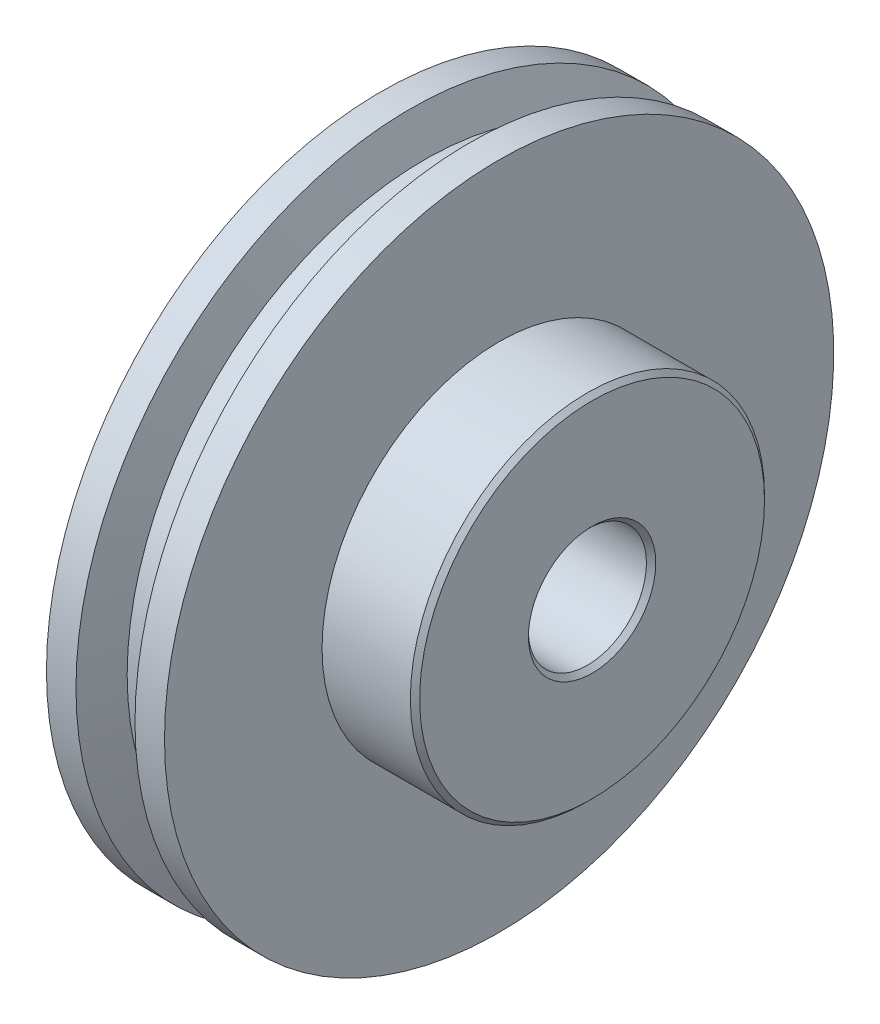
ISO-10303-21;
HEADER;
FILE_DESCRIPTION(('STEP AP214'),'2;1');
FILE_NAME('part.step','',(''),(''),'','','');
FILE_SCHEMA(('AUTOMOTIVE_DESIGN { 1 0 10303 214 1 1 1 1 }'));
ENDSEC;
DATA;
#1=APPLICATION_CONTEXT('core data for automotive mechanical design processes');
#2=APPLICATION_PROTOCOL_DEFINITION('international standard','automotive_design',2000,#1);
#3=PRODUCT_CONTEXT('',#1,'mechanical');
#4=PRODUCT('Part','Part','',(#3));
#5=PRODUCT_RELATED_PRODUCT_CATEGORY('part','',(#4));
#6=PRODUCT_DEFINITION_FORMATION('','',#4);
#7=PRODUCT_DEFINITION_CONTEXT('part definition',#1,'design');
#8=PRODUCT_DEFINITION('design','',#6,#7);
#9=PRODUCT_DEFINITION_SHAPE('','',#8);
#10=(LENGTH_UNIT() NAMED_UNIT(*) SI_UNIT(.MILLI.,.METRE.));
#11=(NAMED_UNIT(*) PLANE_ANGLE_UNIT() SI_UNIT($,.RADIAN.));
#12=(NAMED_UNIT(*) SI_UNIT($,.STERADIAN.) SOLID_ANGLE_UNIT());
#13=UNCERTAINTY_MEASURE_WITH_UNIT(LENGTH_MEASURE(1.E-05),#10,'distance_accuracy_value','');
#14=(GEOMETRIC_REPRESENTATION_CONTEXT(3) GLOBAL_UNCERTAINTY_ASSIGNED_CONTEXT((#13)) GLOBAL_UNIT_ASSIGNED_CONTEXT((#10,
#11,#12)) REPRESENTATION_CONTEXT('',''));
#15=CARTESIAN_POINT('',(0.,0.,0.));
#16=DIRECTION('',(0.,0.,1.));
#17=DIRECTION('',(1.,0.,0.));
#18=AXIS2_PLACEMENT_3D('',#15,#16,#17);
#19=CARTESIAN_POINT('',(3.175,3.175,0.));
#20=DIRECTION('',(-1.,0.,0.));
#21=DIRECTION('',(0.,0.,1.));
#22=AXIS2_PLACEMENT_3D('',#19,#20,#21);
#23=PLANE('',#22);
#24=CARTESIAN_POINT('',(3.175,0.,0.));
#25=DIRECTION('',(-1.,0.,0.));
#26=DIRECTION('',(0.,0.,1.));
#27=AXIS2_PLACEMENT_3D('',#24,#25,#26);
#28=CIRCLE('',#27,18.);
#29=CARTESIAN_POINT('',(3.175,0.,18.));
#30=VERTEX_POINT('',#29);
#31=EDGE_CURVE('E78',#30,#30,#28,.T.);
#32=ORIENTED_EDGE('',*,*,#31,.F.);
#33=EDGE_LOOP('',(#32));
#34=FACE_BOUND('',#33,.T.);
#35=CARTESIAN_POINT('',(3.175,0.,0.));
#36=DIRECTION('',(-1.,0.,0.));
#37=DIRECTION('',(0.,0.,1.));
#38=AXIS2_PLACEMENT_3D('',#35,#36,#37);
#39=CIRCLE('',#38,9.525);
#40=CARTESIAN_POINT('',(3.175,0.,9.525));
#41=VERTEX_POINT('',#40);
#42=EDGE_CURVE('E60',#41,#41,#39,.F.);
#43=ORIENTED_EDGE('',*,*,#42,.F.);
#44=EDGE_LOOP('',(#43));
#45=FACE_BOUND('',#44,.T.);
#46=ADVANCED_FACE('F34',(#34,#45),#23,.F.);
#47=CARTESIAN_POINT('',(-3.175,3.175,0.));
#48=DIRECTION('',(1.,0.,0.));
#49=DIRECTION('',(0.,0.,-1.));
#50=AXIS2_PLACEMENT_3D('',#47,#48,#49);
#51=PLANE('',#50);
#52=CARTESIAN_POINT('',(-3.175,0.,0.));
#53=DIRECTION('',(1.,0.,0.));
#54=DIRECTION('',(0.,0.,-1.));
#55=AXIS2_PLACEMENT_3D('',#52,#53,#54);
#56=CIRCLE('',#55,3.425);
#57=CARTESIAN_POINT('',(-3.175,0.,-3.425));
#58=VERTEX_POINT('',#57);
#59=EDGE_CURVE('E49',#58,#58,#56,.T.);
#60=ORIENTED_EDGE('',*,*,#59,.T.);
#61=EDGE_LOOP('',(#60));
#62=FACE_BOUND('',#61,.T.);
#63=CARTESIAN_POINT('',(-3.175,0.,0.));
#64=DIRECTION('',(-1.,0.,0.));
#65=DIRECTION('',(0.,0.,1.));
#66=AXIS2_PLACEMENT_3D('',#63,#64,#65);
#67=CIRCLE('',#66,18.);
#68=CARTESIAN_POINT('',(-3.175,0.,18.));
#69=VERTEX_POINT('',#68);
#70=EDGE_CURVE('E63',#69,#69,#67,.T.);
#71=ORIENTED_EDGE('',*,*,#70,.T.);
#72=EDGE_LOOP('',(#71));
#73=FACE_BOUND('',#72,.T.);
#74=ADVANCED_FACE('F86',(#62,#73),#51,.F.);
#75=CARTESIAN_POINT('',(0.,0.,0.));
#76=DIRECTION('',(-1.,0.,0.));
#77=DIRECTION('',(0.,0.,1.));
#78=AXIS2_PLACEMENT_3D('',#75,#76,#77);
#79=CYLINDRICAL_SURFACE('',#78,18.);
#80=ORIENTED_EDGE('',*,*,#70,.F.);
#81=EDGE_LOOP('',(#80));
#82=FACE_BOUND('',#81,.T.);
#83=CARTESIAN_POINT('',(-1.5875,0.,0.));
#84=DIRECTION('',(-1.,0.,0.));
#85=DIRECTION('',(0.,0.,1.));
#86=AXIS2_PLACEMENT_3D('',#83,#84,#85);
#87=CIRCLE('',#86,18.);
#88=CARTESIAN_POINT('',(-1.5875,0.,18.));
#89=VERTEX_POINT('',#88);
#90=EDGE_CURVE('E66',#89,#89,#87,.T.);
#91=ORIENTED_EDGE('',*,*,#90,.T.);
#92=EDGE_LOOP('',(#91));
#93=FACE_BOUND('',#92,.T.);
#94=ADVANCED_FACE('F118',(#82,#93),#79,.T.);
#95=CARTESIAN_POINT('',(-0.833641219368297,0.,0.));
#96=DIRECTION('',(-1.,0.,0.));
#97=DIRECTION('',(0.,0.,1.));
#98=AXIS2_PLACEMENT_3D('',#95,#96,#97);
#99=CONICAL_SURFACE('',#98,16.,1.21033521014277);
#100=ORIENTED_EDGE('',*,*,#90,.F.);
#101=EDGE_LOOP('',(#100));
#102=FACE_BOUND('',#101,.T.);
#103=CARTESIAN_POINT('',(-0.833641219368297,0.,0.));
#104=DIRECTION('',(-1.,0.,0.));
#105=DIRECTION('',(0.,0.,1.));
#106=AXIS2_PLACEMENT_3D('',#103,#104,#105);
#107=CIRCLE('',#106,16.);
#108=CARTESIAN_POINT('',(-0.833641219368297,0.,16.));
#109=VERTEX_POINT('',#108);
#110=EDGE_CURVE('E69',#109,#109,#107,.T.);
#111=ORIENTED_EDGE('',*,*,#110,.T.);
#112=EDGE_LOOP('',(#111));
#113=FACE_BOUND('',#112,.T.);
#114=ADVANCED_FACE('F114',(#102,#113),#99,.T.);
#115=CARTESIAN_POINT('',(0.,0.,0.));
#116=DIRECTION('',(-1.,0.,0.));
#117=DIRECTION('',(0.,0.,1.));
#118=AXIS2_PLACEMENT_3D('',#115,#116,#117);
#119=CYLINDRICAL_SURFACE('',#118,16.);
#120=ORIENTED_EDGE('',*,*,#110,.F.);
#121=EDGE_LOOP('',(#120));
#122=FACE_BOUND('',#121,.T.);
#123=CARTESIAN_POINT('',(0.833641219368297,0.,0.));
#124=DIRECTION('',(-1.,0.,0.));
#125=DIRECTION('',(0.,0.,1.));
#126=AXIS2_PLACEMENT_3D('',#123,#124,#125);
#127=CIRCLE('',#126,16.);
#128=CARTESIAN_POINT('',(0.833641219368297,0.,16.));
#129=VERTEX_POINT('',#128);
#130=EDGE_CURVE('E72',#129,#129,#127,.T.);
#131=ORIENTED_EDGE('',*,*,#130,.T.);
#132=EDGE_LOOP('',(#131));
#133=FACE_BOUND('',#132,.T.);
#134=ADVANCED_FACE('F110',(#122,#133),#119,.T.);
#135=CARTESIAN_POINT('',(1.5875,0.,0.));
#136=DIRECTION('',(1.,0.,0.));
#137=DIRECTION('',(0.,0.,-1.));
#138=AXIS2_PLACEMENT_3D('',#135,#136,#137);
#139=CONICAL_SURFACE('',#138,18.,1.21033521014277);
#140=ORIENTED_EDGE('',*,*,#130,.F.);
#141=EDGE_LOOP('',(#140));
#142=FACE_BOUND('',#141,.T.);
#143=CARTESIAN_POINT('',(1.5875,0.,0.));
#144=DIRECTION('',(-1.,0.,0.));
#145=DIRECTION('',(0.,0.,1.));
#146=AXIS2_PLACEMENT_3D('',#143,#144,#145);
#147=CIRCLE('',#146,18.);
#148=CARTESIAN_POINT('',(1.5875,0.,18.));
#149=VERTEX_POINT('',#148);
#150=EDGE_CURVE('E75',#149,#149,#147,.T.);
#151=ORIENTED_EDGE('',*,*,#150,.T.);
#152=EDGE_LOOP('',(#151));
#153=FACE_BOUND('',#152,.T.);
#154=ADVANCED_FACE('F106',(#142,#153),#139,.T.);
#155=CARTESIAN_POINT('',(0.,0.,0.));
#156=DIRECTION('',(-1.,0.,0.));
#157=DIRECTION('',(0.,0.,1.));
#158=AXIS2_PLACEMENT_3D('',#155,#156,#157);
#159=CYLINDRICAL_SURFACE('',#158,18.);
#160=ORIENTED_EDGE('',*,*,#150,.F.);
#161=EDGE_LOOP('',(#160));
#162=FACE_BOUND('',#161,.T.);
#163=ORIENTED_EDGE('',*,*,#31,.T.);
#164=EDGE_LOOP('',(#163));
#165=FACE_BOUND('',#164,.T.);
#166=ADVANCED_FACE('F82',(#162,#165),#159,.T.);
#167=CARTESIAN_POINT('',(0.,0.,0.));
#168=DIRECTION('',(-1.,0.,0.));
#169=DIRECTION('',(0.,0.,1.));
#170=AXIS2_PLACEMENT_3D('',#167,#168,#169);
#171=CYLINDRICAL_SURFACE('',#170,3.175);
#172=CARTESIAN_POINT('',(-2.92500000000001,0.,0.));
#173=DIRECTION('',(1.,0.,0.));
#174=DIRECTION('',(0.,0.,-1.));
#175=AXIS2_PLACEMENT_3D('',#172,#173,#174);
#176=CIRCLE('',#175,3.175);
#177=CARTESIAN_POINT('',(-2.92500000000001,0.,-3.175));
#178=VERTEX_POINT('',#177);
#179=EDGE_CURVE('E54',#178,#178,#176,.F.);
#180=ORIENTED_EDGE('',*,*,#179,.T.);
#181=EDGE_LOOP('',(#180));
#182=FACE_BOUND('',#181,.T.);
#183=CARTESIAN_POINT('',(7.92500000000001,0.,0.));
#184=DIRECTION('',(1.,0.,0.));
#185=DIRECTION('',(0.,0.,-1.));
#186=AXIS2_PLACEMENT_3D('',#183,#184,#185);
#187=CIRCLE('',#186,3.175);
#188=CARTESIAN_POINT('',(7.92500000000001,0.,-3.175));
#189=VERTEX_POINT('',#188);
#190=EDGE_CURVE('E57',#189,#189,#187,.T.);
#191=ORIENTED_EDGE('',*,*,#190,.T.);
#192=EDGE_LOOP('',(#191));
#193=FACE_BOUND('',#192,.T.);
#194=ADVANCED_FACE('F93',(#182,#193),#171,.F.);
#195=CARTESIAN_POINT('',(8.175,0.,0.));
#196=DIRECTION('',(-1.,0.,0.));
#197=DIRECTION('',(0.,0.,1.));
#198=AXIS2_PLACEMENT_3D('',#195,#196,#197);
#199=CYLINDRICAL_SURFACE('',#198,9.525);
#200=CARTESIAN_POINT('',(7.925,0.,0.));
#201=DIRECTION('',(1.,0.,0.));
#202=DIRECTION('',(0.,0.,-1.));
#203=AXIS2_PLACEMENT_3D('',#200,#201,#202);
#204=CIRCLE('',#203,9.525);
#205=CARTESIAN_POINT('',(7.925,0.,-9.525));
#206=VERTEX_POINT('',#205);
#207=EDGE_CURVE('E10',#206,#206,#204,.F.);
#208=ORIENTED_EDGE('',*,*,#207,.T.);
#209=EDGE_LOOP('',(#208));
#210=FACE_BOUND('',#209,.T.);
#211=ORIENTED_EDGE('',*,*,#42,.T.);
#212=EDGE_LOOP('',(#211));
#213=FACE_BOUND('',#212,.T.);
#214=ADVANCED_FACE('F90',(#210,#213),#199,.T.);
#215=CARTESIAN_POINT('',(8.175,0.,0.));
#216=DIRECTION('',(1.,0.,0.));
#217=DIRECTION('',(0.,0.,-1.));
#218=AXIS2_PLACEMENT_3D('',#215,#216,#217);
#219=PLANE('',#218);
#220=CARTESIAN_POINT('',(8.175,0.,0.));
#221=DIRECTION('',(1.,0.,0.));
#222=DIRECTION('',(0.,0.,-1.));
#223=AXIS2_PLACEMENT_3D('',#220,#221,#222);
#224=CIRCLE('',#223,3.425);
#225=CARTESIAN_POINT('',(8.175,0.,-3.425));
#226=VERTEX_POINT('',#225);
#227=EDGE_CURVE('E41',#226,#226,#224,.F.);
#228=ORIENTED_EDGE('',*,*,#227,.T.);
#229=EDGE_LOOP('',(#228));
#230=FACE_BOUND('',#229,.T.);
#231=CARTESIAN_POINT('',(8.175,0.,0.));
#232=DIRECTION('',(1.,0.,0.));
#233=DIRECTION('',(0.,0.,-1.));
#234=AXIS2_PLACEMENT_3D('',#231,#232,#233);
#235=CIRCLE('',#234,9.275);
#236=CARTESIAN_POINT('',(8.175,0.,-9.275));
#237=VERTEX_POINT('',#236);
#238=EDGE_CURVE('E45',#237,#237,#235,.T.);
#239=ORIENTED_EDGE('',*,*,#238,.T.);
#240=EDGE_LOOP('',(#239));
#241=FACE_BOUND('',#240,.T.);
#242=ADVANCED_FACE('F92',(#230,#241),#219,.T.);
#243=CARTESIAN_POINT('',(-2.92500000000001,0.,0.));
#244=DIRECTION('',(-1.,0.,0.));
#245=DIRECTION('',(0.,0.,1.));
#246=AXIS2_PLACEMENT_3D('',#243,#244,#245);
#247=CONICAL_SURFACE('',#246,3.175,0.785398163397468);
#248=ORIENTED_EDGE('',*,*,#59,.F.);
#249=EDGE_LOOP('',(#248));
#250=FACE_BOUND('',#249,.T.);
#251=ORIENTED_EDGE('',*,*,#179,.F.);
#252=EDGE_LOOP('',(#251));
#253=FACE_BOUND('',#252,.T.);
#254=ADVANCED_FACE('F99',(#250,#253),#247,.F.);
#255=CARTESIAN_POINT('',(7.92500000000001,0.,0.));
#256=DIRECTION('',(1.,0.,0.));
#257=DIRECTION('',(0.,0.,-1.));
#258=AXIS2_PLACEMENT_3D('',#255,#256,#257);
#259=CONICAL_SURFACE('',#258,3.175,0.785398163397453);
#260=ORIENTED_EDGE('',*,*,#227,.F.);
#261=EDGE_LOOP('',(#260));
#262=FACE_BOUND('',#261,.T.);
#263=ORIENTED_EDGE('',*,*,#190,.F.);
#264=EDGE_LOOP('',(#263));
#265=FACE_BOUND('',#264,.T.);
#266=ADVANCED_FACE('F127',(#262,#265),#259,.F.);
#267=CARTESIAN_POINT('',(8.175,0.,0.));
#268=DIRECTION('',(-1.,0.,0.));
#269=DIRECTION('',(0.,0.,1.));
#270=AXIS2_PLACEMENT_3D('',#267,#268,#269);
#271=CONICAL_SURFACE('',#270,9.275,0.785398163397441);
#272=ORIENTED_EDGE('',*,*,#207,.F.);
#273=EDGE_LOOP('',(#272));
#274=FACE_BOUND('',#273,.T.);
#275=ORIENTED_EDGE('',*,*,#238,.F.);
#276=EDGE_LOOP('',(#275));
#277=FACE_BOUND('',#276,.T.);
#278=ADVANCED_FACE('F36',(#274,#277),#271,.T.);
#279=CLOSED_SHELL('',(#46,#74,#94,#114,#134,#154,#166,#194,#214,#242,#254,#266,#278));
#280=MANIFOLD_SOLID_BREP('B2',#279);
#281=ADVANCED_BREP_SHAPE_REPRESENTATION('',(#18,#280),#14);
#282=SHAPE_DEFINITION_REPRESENTATION(#9,#281);
ENDSEC;
END-ISO-10303-21;
